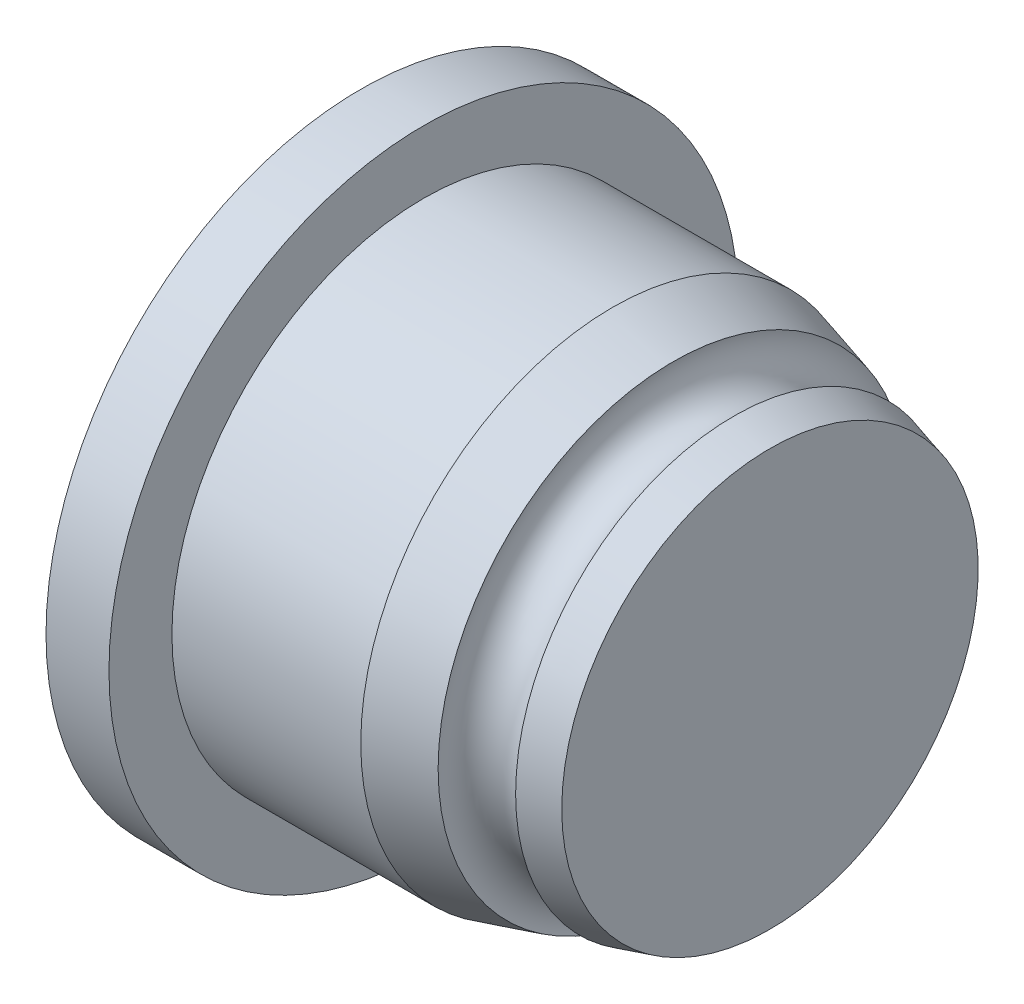
ISO-10303-21;
HEADER;
FILE_DESCRIPTION(('STEP AP214'),'2;1');
FILE_NAME('part.step','',(''),(''),'','','');
FILE_SCHEMA(('AUTOMOTIVE_DESIGN { 1 0 10303 214 1 1 1 1 }'));
ENDSEC;
DATA;
#1=APPLICATION_CONTEXT('core data for automotive mechanical design processes');
#2=APPLICATION_PROTOCOL_DEFINITION('international standard','automotive_design',2000,#1);
#3=PRODUCT_CONTEXT('',#1,'mechanical');
#4=PRODUCT('Part','Part','',(#3));
#5=PRODUCT_RELATED_PRODUCT_CATEGORY('part','',(#4));
#6=PRODUCT_DEFINITION_FORMATION('','',#4);
#7=PRODUCT_DEFINITION_CONTEXT('part definition',#1,'design');
#8=PRODUCT_DEFINITION('design','',#6,#7);
#9=PRODUCT_DEFINITION_SHAPE('','',#8);
#10=(LENGTH_UNIT() NAMED_UNIT(*) SI_UNIT(.MILLI.,.METRE.));
#11=(NAMED_UNIT(*) PLANE_ANGLE_UNIT() SI_UNIT($,.RADIAN.));
#12=(NAMED_UNIT(*) SI_UNIT($,.STERADIAN.) SOLID_ANGLE_UNIT());
#13=UNCERTAINTY_MEASURE_WITH_UNIT(LENGTH_MEASURE(1.E-05),#10,'distance_accuracy_value','');
#14=(GEOMETRIC_REPRESENTATION_CONTEXT(3) GLOBAL_UNCERTAINTY_ASSIGNED_CONTEXT((#13)) GLOBAL_UNIT_ASSIGNED_CONTEXT((#10,
#11,#12)) REPRESENTATION_CONTEXT('',''));
#15=CARTESIAN_POINT('',(0.,0.,0.));
#16=DIRECTION('',(0.,0.,1.));
#17=DIRECTION('',(1.,0.,0.));
#18=AXIS2_PLACEMENT_3D('',#15,#16,#17);
#19=CARTESIAN_POINT('',(6.5,0.,0.));
#20=DIRECTION('',(-1.,0.,0.));
#21=DIRECTION('',(0.,0.,1.));
#22=AXIS2_PLACEMENT_3D('',#19,#20,#21);
#23=PLANE('',#22);
#24=CARTESIAN_POINT('',(6.5,0.,0.));
#25=DIRECTION('',(-1.,0.,0.));
#26=DIRECTION('',(0.,0.,1.));
#27=AXIS2_PLACEMENT_3D('',#24,#25,#26);
#28=CIRCLE('',#27,3.30752548778353);
#29=CARTESIAN_POINT('',(6.5,0.,3.30752548778353));
#30=VERTEX_POINT('',#29);
#31=EDGE_CURVE('E10',#30,#30,#28,.T.);
#32=ORIENTED_EDGE('',*,*,#31,.F.);
#33=EDGE_LOOP('',(#32));
#34=FACE_BOUND('',#33,.T.);
#35=ADVANCED_FACE('F43',(#34),#23,.F.);
#36=CARTESIAN_POINT('',(6.5,0.,0.));
#37=DIRECTION('',(-1.,0.,0.));
#38=DIRECTION('',(0.,0.,1.));
#39=AXIS2_PLACEMENT_3D('',#36,#37,#38);
#40=CONICAL_SURFACE('',#39,3.30752548778353,0.27021517394905);
#41=CARTESIAN_POINT('',(5.92595321213902,0.,0.));
#42=DIRECTION('',(-1.,0.,0.));
#43=DIRECTION('',(0.,0.,1.));
#44=AXIS2_PLACEMENT_3D('',#41,#42,#43);
#45=CIRCLE('',#44,3.46653059554892);
#46=CARTESIAN_POINT('',(5.92595321213902,0.,3.46653059554892));
#47=VERTEX_POINT('',#46);
#48=EDGE_CURVE('E51',#47,#47,#45,.T.);
#49=ORIENTED_EDGE('',*,*,#48,.F.);
#50=EDGE_LOOP('',(#49));
#51=FACE_BOUND('',#50,.T.);
#52=ORIENTED_EDGE('',*,*,#31,.T.);
#53=EDGE_LOOP('',(#52));
#54=FACE_BOUND('',#53,.T.);
#55=ADVANCED_FACE('F122',(#51,#54),#40,.T.);
#56=CARTESIAN_POINT('',(5.44409647193974,0.,0.));
#57=DIRECTION('',(-1.,0.,0.));
#58=DIRECTION('',(0.,0.,1.));
#59=AXIS2_PLACEMENT_3D('',#56,#57,#58);
#60=TOROIDAL_SURFACE('',#59,3.6,0.5);
#61=CARTESIAN_POINT('',(4.96223973174047,0.,0.));
#62=DIRECTION('',(-1.,0.,0.));
#63=DIRECTION('',(0.,0.,1.));
#64=AXIS2_PLACEMENT_3D('',#61,#62,#63);
#65=CIRCLE('',#64,3.73346940445109);
#66=CARTESIAN_POINT('',(4.96223973174047,0.,3.73346940445109));
#67=VERTEX_POINT('',#66);
#68=EDGE_CURVE('E56',#67,#67,#65,.T.);
#69=ORIENTED_EDGE('',*,*,#68,.F.);
#70=EDGE_LOOP('',(#69));
#71=FACE_BOUND('',#70,.T.);
#72=ORIENTED_EDGE('',*,*,#48,.T.);
#73=EDGE_LOOP('',(#72));
#74=FACE_BOUND('',#73,.T.);
#75=ADVANCED_FACE('F116',(#71,#74),#60,.F.);
#76=CARTESIAN_POINT('',(4.96223973174047,0.,0.));
#77=DIRECTION('',(-1.,0.,0.));
#78=DIRECTION('',(0.,0.,1.));
#79=AXIS2_PLACEMENT_3D('',#76,#77,#78);
#80=CONICAL_SURFACE('',#79,3.73346940445109,0.270215173949048);
#81=CARTESIAN_POINT('',(4.,0.,0.));
#82=DIRECTION('',(-1.,0.,0.));
#83=DIRECTION('',(0.,0.,1.));
#84=AXIS2_PLACEMENT_3D('',#81,#82,#83);
#85=CIRCLE('',#84,4.);
#86=CARTESIAN_POINT('',(4.,0.,4.));
#87=VERTEX_POINT('',#86);
#88=EDGE_CURVE('E62',#87,#87,#85,.T.);
#89=ORIENTED_EDGE('',*,*,#88,.F.);
#90=EDGE_LOOP('',(#89));
#91=FACE_BOUND('',#90,.T.);
#92=ORIENTED_EDGE('',*,*,#68,.T.);
#93=EDGE_LOOP('',(#92));
#94=FACE_BOUND('',#93,.T.);
#95=ADVANCED_FACE('F110',(#91,#94),#80,.T.);
#96=CARTESIAN_POINT('',(0.,0.,0.));
#97=DIRECTION('',(-1.,0.,0.));
#98=DIRECTION('',(0.,0.,1.));
#99=AXIS2_PLACEMENT_3D('',#96,#97,#98);
#100=CYLINDRICAL_SURFACE('',#99,4.);
#101=CARTESIAN_POINT('',(1.,0.,0.));
#102=DIRECTION('',(-1.,0.,0.));
#103=DIRECTION('',(0.,0.,1.));
#104=AXIS2_PLACEMENT_3D('',#101,#102,#103);
#105=CIRCLE('',#104,4.);
#106=CARTESIAN_POINT('',(1.,0.,4.));
#107=VERTEX_POINT('',#106);
#108=EDGE_CURVE('E66',#107,#107,#105,.T.);
#109=ORIENTED_EDGE('',*,*,#108,.F.);
#110=EDGE_LOOP('',(#109));
#111=FACE_BOUND('',#110,.T.);
#112=ORIENTED_EDGE('',*,*,#88,.T.);
#113=EDGE_LOOP('',(#112));
#114=FACE_BOUND('',#113,.T.);
#115=ADVANCED_FACE('F104',(#111,#114),#100,.T.);
#116=CARTESIAN_POINT('',(1.,0.,-5.));
#117=DIRECTION('',(-1.,0.,0.));
#118=DIRECTION('',(0.,0.,1.));
#119=AXIS2_PLACEMENT_3D('',#116,#117,#118);
#120=PLANE('',#119);
#121=CARTESIAN_POINT('',(1.,0.,0.));
#122=DIRECTION('',(-1.,0.,0.));
#123=DIRECTION('',(0.,0.,1.));
#124=AXIS2_PLACEMENT_3D('',#121,#122,#123);
#125=CIRCLE('',#124,5.);
#126=CARTESIAN_POINT('',(1.,0.,5.));
#127=VERTEX_POINT('',#126);
#128=EDGE_CURVE('E70',#127,#127,#125,.T.);
#129=ORIENTED_EDGE('',*,*,#128,.F.);
#130=EDGE_LOOP('',(#129));
#131=FACE_BOUND('',#130,.T.);
#132=ORIENTED_EDGE('',*,*,#108,.T.);
#133=EDGE_LOOP('',(#132));
#134=FACE_BOUND('',#133,.T.);
#135=ADVANCED_FACE('F98',(#131,#134),#120,.F.);
#136=CARTESIAN_POINT('',(0.,0.,0.));
#137=DIRECTION('',(-1.,0.,0.));
#138=DIRECTION('',(0.,0.,1.));
#139=AXIS2_PLACEMENT_3D('',#136,#137,#138);
#140=CYLINDRICAL_SURFACE('',#139,5.);
#141=CARTESIAN_POINT('',(0.,0.,0.));
#142=DIRECTION('',(-1.,0.,0.));
#143=DIRECTION('',(0.,0.,1.));
#144=AXIS2_PLACEMENT_3D('',#141,#142,#143);
#145=CIRCLE('',#144,5.);
#146=CARTESIAN_POINT('',(0.,0.,5.));
#147=VERTEX_POINT('',#146);
#148=EDGE_CURVE('E74',#147,#147,#145,.T.);
#149=ORIENTED_EDGE('',*,*,#148,.F.);
#150=EDGE_LOOP('',(#149));
#151=FACE_BOUND('',#150,.T.);
#152=ORIENTED_EDGE('',*,*,#128,.T.);
#153=EDGE_LOOP('',(#152));
#154=FACE_BOUND('',#153,.T.);
#155=ADVANCED_FACE('F92',(#151,#154),#140,.T.);
#156=CARTESIAN_POINT('',(0.,0.,0.));
#157=DIRECTION('',(1.,0.,0.));
#158=DIRECTION('',(0.,0.,-1.));
#159=AXIS2_PLACEMENT_3D('',#156,#157,#158);
#160=PLANE('',#159);
#161=CARTESIAN_POINT('',(0.,0.,0.));
#162=DIRECTION('',(1.,0.,0.));
#163=DIRECTION('',(0.,0.,-1.));
#164=AXIS2_PLACEMENT_3D('',#161,#162,#163);
#165=CIRCLE('',#164,2.55);
#166=CARTESIAN_POINT('',(0.,0.,-2.55));
#167=VERTEX_POINT('',#166);
#168=EDGE_CURVE('E46',#167,#167,#165,.F.);
#169=ORIENTED_EDGE('',*,*,#168,.F.);
#170=EDGE_LOOP('',(#169));
#171=FACE_BOUND('',#170,.T.);
#172=ORIENTED_EDGE('',*,*,#148,.T.);
#173=EDGE_LOOP('',(#172));
#174=FACE_BOUND('',#173,.T.);
#175=ADVANCED_FACE('F89',(#171,#174),#160,.F.);
#176=CARTESIAN_POINT('',(-1.2E-05,0.,0.));
#177=DIRECTION('',(1.,0.,0.));
#178=DIRECTION('',(0.,0.,-1.));
#179=AXIS2_PLACEMENT_3D('',#176,#177,#178);
#180=CYLINDRICAL_SURFACE('',#179,2.55);
#181=CARTESIAN_POINT('',(5.,0.,0.));
#182=DIRECTION('',(-1.,0.,0.));
#183=DIRECTION('',(0.,0.,1.));
#184=AXIS2_PLACEMENT_3D('',#181,#182,#183);
#185=CIRCLE('',#184,2.55);
#186=CARTESIAN_POINT('',(5.,0.,-2.55));
#187=VERTEX_POINT('',#186);
#188=EDGE_CURVE('E78',#187,#187,#185,.T.);
#189=CARTESIAN_POINT('',(5.,0.,-2.55));
#190=CARTESIAN_POINT('',(4.94791666666667,0.,-2.55));
#191=CARTESIAN_POINT('',(4.89583333333333,0.,-2.55));
#192=CARTESIAN_POINT('',(4.79166666666667,0.,-2.55));
#193=CARTESIAN_POINT('',(4.73958333333333,0.,-2.55));
#194=CARTESIAN_POINT('',(4.63541666666667,0.,-2.55));
#195=CARTESIAN_POINT('',(4.58333333333333,0.,-2.55));
#196=CARTESIAN_POINT('',(4.47916666666667,0.,-2.55));
#197=CARTESIAN_POINT('',(4.42708333333333,0.,-2.55));
#198=CARTESIAN_POINT('',(4.32291666666667,0.,-2.55));
#199=CARTESIAN_POINT('',(4.27083333333333,0.,-2.55));
#200=CARTESIAN_POINT('',(4.16666666666667,0.,-2.55));
#201=CARTESIAN_POINT('',(4.11458333333333,0.,-2.55));
#202=CARTESIAN_POINT('',(4.01041666666667,0.,-2.55));
#203=CARTESIAN_POINT('',(3.95833333333333,0.,-2.55));
#204=CARTESIAN_POINT('',(3.85416666666667,0.,-2.55));
#205=CARTESIAN_POINT('',(3.80208333333333,0.,-2.55));
#206=CARTESIAN_POINT('',(3.69791666666667,0.,-2.55));
#207=CARTESIAN_POINT('',(3.64583333333333,0.,-2.55));
#208=CARTESIAN_POINT('',(3.54166666666667,0.,-2.55));
#209=CARTESIAN_POINT('',(3.48958333333333,0.,-2.55));
#210=CARTESIAN_POINT('',(3.38541666666667,0.,-2.55));
#211=CARTESIAN_POINT('',(3.33333333333333,0.,-2.55));
#212=CARTESIAN_POINT('',(3.22916666666667,0.,-2.55));
#213=CARTESIAN_POINT('',(3.17708333333333,0.,-2.55));
#214=CARTESIAN_POINT('',(3.07291666666667,0.,-2.55));
#215=CARTESIAN_POINT('',(3.02083333333333,0.,-2.55));
#216=CARTESIAN_POINT('',(2.91666666666667,0.,-2.55));
#217=CARTESIAN_POINT('',(2.86458333333333,0.,-2.55));
#218=CARTESIAN_POINT('',(2.76041666666667,0.,-2.55));
#219=CARTESIAN_POINT('',(2.70833333333333,0.,-2.55));
#220=CARTESIAN_POINT('',(2.60416666666667,0.,-2.55));
#221=CARTESIAN_POINT('',(2.55208333333333,0.,-2.55));
#222=CARTESIAN_POINT('',(2.44791666666667,0.,-2.55));
#223=CARTESIAN_POINT('',(2.39583333333333,0.,-2.55));
#224=CARTESIAN_POINT('',(2.29166666666667,0.,-2.55));
#225=CARTESIAN_POINT('',(2.23958333333333,0.,-2.55));
#226=CARTESIAN_POINT('',(2.13541666666667,0.,-2.55));
#227=CARTESIAN_POINT('',(2.08333333333333,0.,-2.55));
#228=CARTESIAN_POINT('',(1.97916666666667,0.,-2.55));
#229=CARTESIAN_POINT('',(1.92708333333333,0.,-2.55));
#230=CARTESIAN_POINT('',(1.82291666666667,0.,-2.55));
#231=CARTESIAN_POINT('',(1.77083333333333,0.,-2.55));
#232=CARTESIAN_POINT('',(1.66666666666667,0.,-2.55));
#233=CARTESIAN_POINT('',(1.61458333333333,0.,-2.55));
#234=CARTESIAN_POINT('',(1.51041666666667,0.,-2.55));
#235=CARTESIAN_POINT('',(1.45833333333333,0.,-2.55));
#236=CARTESIAN_POINT('',(1.35416666666667,0.,-2.55));
#237=CARTESIAN_POINT('',(1.30208333333333,0.,-2.55));
#238=CARTESIAN_POINT('',(1.19791666666667,0.,-2.55));
#239=CARTESIAN_POINT('',(1.14583333333333,0.,-2.55));
#240=CARTESIAN_POINT('',(1.04166666666667,0.,-2.55));
#241=CARTESIAN_POINT('',(0.989583333333333,0.,-2.55));
#242=CARTESIAN_POINT('',(0.885416666666667,0.,-2.55));
#243=CARTESIAN_POINT('',(0.833333333333333,0.,-2.55));
#244=CARTESIAN_POINT('',(0.729166666666667,0.,-2.55));
#245=CARTESIAN_POINT('',(0.677083333333334,0.,-2.55));
#246=CARTESIAN_POINT('',(0.572916666666667,0.,-2.55));
#247=CARTESIAN_POINT('',(0.520833333333333,0.,-2.55));
#248=CARTESIAN_POINT('',(0.416666666666667,0.,-2.55));
#249=CARTESIAN_POINT('',(0.364583333333333,0.,-2.55));
#250=CARTESIAN_POINT('',(0.260416666666667,0.,-2.55));
#251=CARTESIAN_POINT('',(0.208333333333333,0.,-2.55));
#252=CARTESIAN_POINT('',(0.104166666666667,0.,-2.55));
#253=CARTESIAN_POINT('',(0.0520833333333332,0.,-2.55));
#254=CARTESIAN_POINT('',(0.,0.,-2.55));
#255=B_SPLINE_CURVE_WITH_KNOTS('',3,(#189,#190,#191,#192,#193,#194,#195,#196,#197,#198,#199,
#200,#201,#202,#203,#204,#205,#206,#207,#208,#209,#210,#211,#212,#213,#214,#215,#216,#217,#218,
#219,#220,#221,#222,#223,#224,#225,#226,#227,#228,#229,#230,#231,#232,#233,#234,#235,#236,#237,
#238,#239,#240,#241,#242,#243,#244,#245,#246,#247,#248,#249,#250,#251,#252,#253,#254),
.UNSPECIFIED.,.F.,.F.,(4,2,2,2,2,2,2,2,2,2,2,2,2,2,2,2,2,2,2,2,2,2,2,2,2,2,2,2,2,2,2,2,4),(0.,
0.15625,0.3125,0.46875,0.625000000000001,0.781250000000001,0.937500000000001,1.09375,1.25,
1.40625,1.5625,1.71875,1.875,2.03125,2.1875,2.34375,2.5,2.65625,2.8125,2.96875,3.125,3.28125,
3.4375,3.59375,3.75,3.90625,4.0625,4.21875,4.375,4.53125,4.6875,4.84375,5.),.UNSPECIFIED.);
#256=EDGE_CURVE('BSEAM87',#187,#167,#255,.T.);
#257=ORIENTED_EDGE('',*,*,#188,.F.);
#258=ORIENTED_EDGE('',*,*,#168,.T.);
#259=ORIENTED_EDGE('',*,*,#256,.T.);
#260=ORIENTED_EDGE('',*,*,#256,.F.);
#261=EDGE_LOOP('',(#257,#259,#258,#260));
#262=FACE_BOUND('',#261,.T.);
#263=ADVANCED_FACE('F87',(#262),#180,.F.);
#264=CARTESIAN_POINT('',(5.,0.,0.));
#265=DIRECTION('',(-1.,0.,0.));
#266=DIRECTION('',(0.,0.,1.));
#267=AXIS2_PLACEMENT_3D('',#264,#265,#266);
#268=PLANE('',#267);
#269=ORIENTED_EDGE('',*,*,#188,.T.);
#270=EDGE_LOOP('',(#269));
#271=FACE_BOUND('',#270,.T.);
#272=ADVANCED_FACE('F134',(#271),#268,.T.);
#273=CLOSED_SHELL('',(#35,#55,#75,#95,#115,#135,#155,#175,#263,#272));
#274=MANIFOLD_SOLID_BREP('B2',#273);
#275=ADVANCED_BREP_SHAPE_REPRESENTATION('',(#18,#274),#14);
#276=SHAPE_DEFINITION_REPRESENTATION(#9,#275);
ENDSEC;
END-ISO-10303-21;
